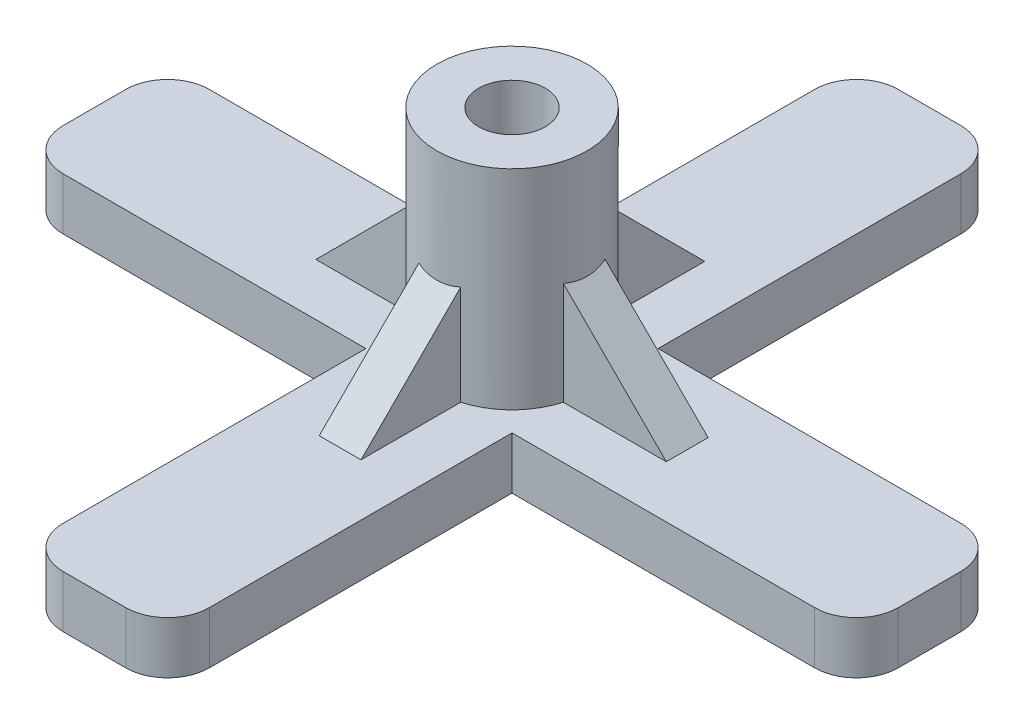
ISO-10303-21;
HEADER;
FILE_DESCRIPTION(('STEP AP214'),'2;1');
FILE_NAME('part.step','',(''),(''),'','','');
FILE_SCHEMA(('AUTOMOTIVE_DESIGN { 1 0 10303 214 1 1 1 1 }'));
ENDSEC;
DATA;
#1=APPLICATION_CONTEXT('core data for automotive mechanical design processes');
#2=APPLICATION_PROTOCOL_DEFINITION('international standard','automotive_design',2000,#1);
#3=PRODUCT_CONTEXT('',#1,'mechanical');
#4=PRODUCT('Part','Part','',(#3));
#5=PRODUCT_RELATED_PRODUCT_CATEGORY('part','',(#4));
#6=PRODUCT_DEFINITION_FORMATION('','',#4);
#7=PRODUCT_DEFINITION_CONTEXT('part definition',#1,'design');
#8=PRODUCT_DEFINITION('design','',#6,#7);
#9=PRODUCT_DEFINITION_SHAPE('','',#8);
#10=(LENGTH_UNIT() NAMED_UNIT(*) SI_UNIT(.MILLI.,.METRE.));
#11=(NAMED_UNIT(*) PLANE_ANGLE_UNIT() SI_UNIT($,.RADIAN.));
#12=(NAMED_UNIT(*) SI_UNIT($,.STERADIAN.) SOLID_ANGLE_UNIT());
#13=UNCERTAINTY_MEASURE_WITH_UNIT(LENGTH_MEASURE(1.E-05),#10,'distance_accuracy_value','');
#14=(GEOMETRIC_REPRESENTATION_CONTEXT(3) GLOBAL_UNCERTAINTY_ASSIGNED_CONTEXT((#13)) GLOBAL_UNIT_ASSIGNED_CONTEXT((#10,
#11,#12)) REPRESENTATION_CONTEXT('',''));
#15=CARTESIAN_POINT('',(0.,0.,0.));
#16=DIRECTION('',(0.,0.,1.));
#17=DIRECTION('',(1.,0.,0.));
#18=AXIS2_PLACEMENT_3D('',#15,#16,#17);
#19=CARTESIAN_POINT('',(1.90499999999999,3.175,-22.86));
#20=DIRECTION('',(0.,-1.,0.));
#21=DIRECTION('',(0.,0.,-1.));
#22=AXIS2_PLACEMENT_3D('',#19,#20,#21);
#23=PLANE('',#22);
#24=CARTESIAN_POINT('',(1.90499999999999,3.175,-22.86));
#25=DIRECTION('',(0.,1.,0.));
#26=DIRECTION('',(0.,0.,-1.));
#27=AXIS2_PLACEMENT_3D('',#24,#25,#26);
#28=CIRCLE('',#27,2.54);
#29=CARTESIAN_POINT('',(4.44499999999999,3.175,-22.8599999999999));
#30=VERTEX_POINT('',#29);
#31=CARTESIAN_POINT('',(1.90499999999998,3.175,-25.4));
#32=VERTEX_POINT('',#31);
#33=EDGE_CURVE('E312',#30,#32,#28,.T.);
#34=ORIENTED_EDGE('',*,*,#33,.T.);
#35=DIRECTION('',(-1.,0.,0.));
#36=VECTOR('',#35,1.);
#37=CARTESIAN_POINT('',(1.90499999999998,3.175,-25.4));
#38=LINE('',#37,#36);
#39=CARTESIAN_POINT('',(-1.90499999999999,3.175,-25.4));
#40=VERTEX_POINT('',#39);
#41=EDGE_CURVE('E315',#32,#40,#38,.T.);
#42=ORIENTED_EDGE('',*,*,#41,.T.);
#43=CARTESIAN_POINT('',(-1.90500000000001,3.175,-22.86));
#44=DIRECTION('',(0.,1.,0.));
#45=DIRECTION('',(0.,0.,1.));
#46=AXIS2_PLACEMENT_3D('',#43,#44,#45);
#47=CIRCLE('',#46,2.54);
#48=CARTESIAN_POINT('',(-4.44500000000001,3.175,-22.8599999999999));
#49=VERTEX_POINT('',#48);
#50=EDGE_CURVE('E318',#40,#49,#47,.T.);
#51=ORIENTED_EDGE('',*,*,#50,.T.);
#52=DIRECTION('',(0.,0.,1.));
#53=VECTOR('',#52,1.);
#54=CARTESIAN_POINT('',(-4.44500000000001,3.175,-22.8599999999999));
#55=LINE('',#54,#53);
#56=CARTESIAN_POINT('',(-4.445,3.175,-4.44499999999999));
#57=VERTEX_POINT('',#56);
#58=EDGE_CURVE('E320',#49,#57,#55,.T.);
#59=ORIENTED_EDGE('',*,*,#58,.T.);
#60=DIRECTION('',(-1.,0.,0.));
#61=VECTOR('',#60,1.);
#62=CARTESIAN_POINT('',(-22.86,3.175,-4.44499999999998));
#63=LINE('',#62,#61);
#64=CARTESIAN_POINT('',(-22.86,3.175,-4.44499999999998));
#65=VERTEX_POINT('',#64);
#66=EDGE_CURVE('E322',#57,#65,#63,.T.);
#67=ORIENTED_EDGE('',*,*,#66,.T.);
#68=CARTESIAN_POINT('',(-22.86,3.175,-1.90499999999998));
#69=DIRECTION('',(0.,1.,0.));
#70=DIRECTION('',(0.,0.,-1.));
#71=AXIS2_PLACEMENT_3D('',#68,#69,#70);
#72=CIRCLE('',#71,2.54);
#73=CARTESIAN_POINT('',(-25.4,3.175,-1.90499999999996));
#74=VERTEX_POINT('',#73);
#75=EDGE_CURVE('E324',#65,#74,#72,.T.);
#76=ORIENTED_EDGE('',*,*,#75,.T.);
#77=DIRECTION('',(0.,0.,1.));
#78=VECTOR('',#77,1.);
#79=CARTESIAN_POINT('',(-25.4,3.175,-1.90499999999996));
#80=LINE('',#79,#78);
#81=CARTESIAN_POINT('',(-25.4,3.175,1.905));
#82=VERTEX_POINT('',#81);
#83=EDGE_CURVE('E326',#74,#82,#80,.T.);
#84=ORIENTED_EDGE('',*,*,#83,.T.);
#85=CARTESIAN_POINT('',(-22.86,3.175,1.90500000000002));
#86=DIRECTION('',(0.,1.,0.));
#87=DIRECTION('',(0.,0.,1.));
#88=AXIS2_PLACEMENT_3D('',#85,#86,#87);
#89=CIRCLE('',#88,2.54);
#90=CARTESIAN_POINT('',(-22.86,3.175,4.44500000000002));
#91=VERTEX_POINT('',#90);
#92=EDGE_CURVE('E328',#82,#91,#89,.T.);
#93=ORIENTED_EDGE('',*,*,#92,.T.);
#94=DIRECTION('',(1.,0.,0.));
#95=VECTOR('',#94,1.);
#96=CARTESIAN_POINT('',(-22.86,3.175,4.44500000000002));
#97=LINE('',#96,#95);
#98=CARTESIAN_POINT('',(-4.445,3.175,4.445));
#99=VERTEX_POINT('',#98);
#100=EDGE_CURVE('E330',#91,#99,#97,.T.);
#101=ORIENTED_EDGE('',*,*,#100,.T.);
#102=DIRECTION('',(0.,0.,1.));
#103=VECTOR('',#102,1.);
#104=CARTESIAN_POINT('',(-4.445,3.175,22.86));
#105=LINE('',#104,#103);
#106=CARTESIAN_POINT('',(-4.445,3.175,22.86));
#107=VERTEX_POINT('',#106);
#108=EDGE_CURVE('E332',#99,#107,#105,.T.);
#109=ORIENTED_EDGE('',*,*,#108,.T.);
#110=CARTESIAN_POINT('',(-1.905,3.175,22.86));
#111=DIRECTION('',(0.,1.,0.));
#112=DIRECTION('',(0.,0.,-1.));
#113=AXIS2_PLACEMENT_3D('',#110,#111,#112);
#114=CIRCLE('',#113,2.54);
#115=CARTESIAN_POINT('',(-1.90499999999998,3.175,25.4));
#116=VERTEX_POINT('',#115);
#117=EDGE_CURVE('E334',#107,#116,#114,.T.);
#118=ORIENTED_EDGE('',*,*,#117,.T.);
#119=DIRECTION('',(1.,0.,0.));
#120=VECTOR('',#119,1.);
#121=CARTESIAN_POINT('',(-1.90499999999998,3.175,25.4));
#122=LINE('',#121,#120);
#123=CARTESIAN_POINT('',(1.90499999999999,3.175,25.4));
#124=VERTEX_POINT('',#123);
#125=EDGE_CURVE('E336',#116,#124,#122,.T.);
#126=ORIENTED_EDGE('',*,*,#125,.T.);
#127=CARTESIAN_POINT('',(1.905,3.175,22.86));
#128=DIRECTION('',(0.,1.,0.));
#129=DIRECTION('',(0.,0.,1.));
#130=AXIS2_PLACEMENT_3D('',#127,#128,#129);
#131=CIRCLE('',#130,2.54);
#132=CARTESIAN_POINT('',(4.445,3.175,22.86));
#133=VERTEX_POINT('',#132);
#134=EDGE_CURVE('E338',#124,#133,#131,.T.);
#135=ORIENTED_EDGE('',*,*,#134,.T.);
#136=DIRECTION('',(0.,0.,-1.));
#137=VECTOR('',#136,1.);
#138=CARTESIAN_POINT('',(4.445,3.175,22.86));
#139=LINE('',#138,#137);
#140=CARTESIAN_POINT('',(4.445,3.175,4.445));
#141=VERTEX_POINT('',#140);
#142=EDGE_CURVE('E340',#133,#141,#139,.T.);
#143=ORIENTED_EDGE('',*,*,#142,.T.);
#144=DIRECTION('',(1.,0.,0.));
#145=VECTOR('',#144,1.);
#146=CARTESIAN_POINT('',(22.86,3.175,4.44500000000001));
#147=LINE('',#146,#145);
#148=CARTESIAN_POINT('',(22.86,3.175,4.44500000000001));
#149=VERTEX_POINT('',#148);
#150=EDGE_CURVE('E342',#141,#149,#147,.T.);
#151=ORIENTED_EDGE('',*,*,#150,.T.);
#152=CARTESIAN_POINT('',(22.86,3.175,1.90500000000001));
#153=DIRECTION('',(0.,1.,0.));
#154=DIRECTION('',(0.,0.,-1.));
#155=AXIS2_PLACEMENT_3D('',#152,#153,#154);
#156=CIRCLE('',#155,2.54);
#157=CARTESIAN_POINT('',(25.4,3.175,1.90499999999999));
#158=VERTEX_POINT('',#157);
#159=EDGE_CURVE('E344',#149,#158,#156,.T.);
#160=ORIENTED_EDGE('',*,*,#159,.T.);
#161=DIRECTION('',(0.,0.,-1.));
#162=VECTOR('',#161,1.);
#163=CARTESIAN_POINT('',(25.4,3.175,1.90499999999999));
#164=LINE('',#163,#162);
#165=CARTESIAN_POINT('',(25.4,3.175,-1.90499999999997));
#166=VERTEX_POINT('',#165);
#167=EDGE_CURVE('E346',#158,#166,#164,.T.);
#168=ORIENTED_EDGE('',*,*,#167,.T.);
#169=CARTESIAN_POINT('',(22.86,3.175,-1.90499999999999));
#170=DIRECTION('',(0.,1.,0.));
#171=DIRECTION('',(0.,0.,1.));
#172=AXIS2_PLACEMENT_3D('',#169,#170,#171);
#173=CIRCLE('',#172,2.54);
#174=CARTESIAN_POINT('',(22.86,3.175,-4.44499999999999));
#175=VERTEX_POINT('',#174);
#176=EDGE_CURVE('E348',#166,#175,#173,.T.);
#177=ORIENTED_EDGE('',*,*,#176,.T.);
#178=DIRECTION('',(-1.,0.,0.));
#179=VECTOR('',#178,1.);
#180=CARTESIAN_POINT('',(22.86,3.175,-4.44499999999999));
#181=LINE('',#180,#179);
#182=CARTESIAN_POINT('',(4.445,3.175,-4.44499999999999));
#183=VERTEX_POINT('',#182);
#184=EDGE_CURVE('E350',#175,#183,#181,.T.);
#185=ORIENTED_EDGE('',*,*,#184,.T.);
#186=DIRECTION('',(0.,0.,-1.));
#187=VECTOR('',#186,1.);
#188=CARTESIAN_POINT('',(4.44499999999999,3.175,-22.8599999999999));
#189=LINE('',#188,#187);
#190=EDGE_CURVE('E352',#183,#30,#189,.T.);
#191=ORIENTED_EDGE('',*,*,#190,.T.);
#192=EDGE_LOOP('',(#34,#42,#51,#59,#67,#76,#84,#93,#101,#109,#118,#126,#135,#143,#151,#160,#168,
#177,#185,#191));
#193=FACE_BOUND('',#192,.T.);
#194=DIRECTION('',(-1.,0.,0.));
#195=VECTOR('',#194,1.);
#196=CARTESIAN_POINT('',(1.27,3.175,-10.456553941695));
#197=LINE('',#196,#195);
#198=CARTESIAN_POINT('',(1.27,3.175,-10.456553941695));
#199=VERTEX_POINT('',#198);
#200=CARTESIAN_POINT('',(-1.27,3.175,-10.456553941695));
#201=VERTEX_POINT('',#200);
#202=EDGE_CURVE('E48',#199,#201,#197,.T.);
#203=ORIENTED_EDGE('',*,*,#202,.F.);
#204=DIRECTION('',(0.,0.,-1.));
#205=VECTOR('',#204,1.);
#206=CARTESIAN_POINT('',(1.27,3.175,-10.456553941695));
#207=LINE('',#206,#205);
#208=CARTESIAN_POINT('',(1.27,3.175,-4.39207058231081));
#209=VERTEX_POINT('',#208);
#210=EDGE_CURVE('E255',#209,#199,#207,.T.);
#211=ORIENTED_EDGE('',*,*,#210,.F.);
#212=CARTESIAN_POINT('',(0.,3.175,0.));
#213=DIRECTION('',(0.,-1.,0.));
#214=DIRECTION('',(0.,0.,-1.));
#215=AXIS2_PLACEMENT_3D('',#212,#213,#214);
#216=CIRCLE('',#215,4.572);
#217=CARTESIAN_POINT('',(4.39207058231081,3.175,-1.27));
#218=VERTEX_POINT('',#217);
#219=EDGE_CURVE('E459',#218,#209,#216,.F.);
#220=ORIENTED_EDGE('',*,*,#219,.F.);
#221=DIRECTION('',(1.,0.,0.));
#222=VECTOR('',#221,1.);
#223=CARTESIAN_POINT('',(10.65929558815,3.175,-1.27));
#224=LINE('',#223,#222);
#225=CARTESIAN_POINT('',(10.65929558815,3.175,-1.27));
#226=VERTEX_POINT('',#225);
#227=EDGE_CURVE('E280',#218,#226,#224,.T.);
#228=ORIENTED_EDGE('',*,*,#227,.T.);
#229=DIRECTION('',(0.,0.,-1.));
#230=VECTOR('',#229,1.);
#231=CARTESIAN_POINT('',(10.65929558815,3.175,1.27));
#232=LINE('',#231,#230);
#233=CARTESIAN_POINT('',(10.65929558815,3.175,1.27));
#234=VERTEX_POINT('',#233);
#235=EDGE_CURVE('E282',#234,#226,#232,.T.);
#236=ORIENTED_EDGE('',*,*,#235,.F.);
#237=DIRECTION('',(1.,0.,0.));
#238=VECTOR('',#237,1.);
#239=CARTESIAN_POINT('',(10.65929558815,3.175,1.27));
#240=LINE('',#239,#238);
#241=CARTESIAN_POINT('',(4.39207058231081,3.175,1.27));
#242=VERTEX_POINT('',#241);
#243=EDGE_CURVE('E279',#242,#234,#240,.T.);
#244=ORIENTED_EDGE('',*,*,#243,.F.);
#245=CARTESIAN_POINT('',(1.27,3.175,4.39207058231081));
#246=VERTEX_POINT('',#245);
#247=EDGE_CURVE('E458',#246,#242,#216,.F.);
#248=ORIENTED_EDGE('',*,*,#247,.F.);
#249=DIRECTION('',(0.,0.,-1.));
#250=VECTOR('',#249,1.);
#251=CARTESIAN_POINT('',(1.27,3.175,10.456553941695));
#252=LINE('',#251,#250);
#253=CARTESIAN_POINT('',(1.27,3.175,10.456553941695));
#254=VERTEX_POINT('',#253);
#255=EDGE_CURVE('E266',#254,#246,#252,.T.);
#256=ORIENTED_EDGE('',*,*,#255,.F.);
#257=DIRECTION('',(-1.,0.,0.));
#258=VECTOR('',#257,1.);
#259=CARTESIAN_POINT('',(1.27,3.175,10.456553941695));
#260=LINE('',#259,#258);
#261=CARTESIAN_POINT('',(-1.27,3.175,10.456553941695));
#262=VERTEX_POINT('',#261);
#263=EDGE_CURVE('E269',#254,#262,#260,.T.);
#264=ORIENTED_EDGE('',*,*,#263,.T.);
#265=DIRECTION('',(0.,0.,-1.));
#266=VECTOR('',#265,1.);
#267=CARTESIAN_POINT('',(-1.27,3.175,10.456553941695));
#268=LINE('',#267,#266);
#269=CARTESIAN_POINT('',(-1.27,3.175,4.39207058231081));
#270=VERTEX_POINT('',#269);
#271=EDGE_CURVE('E267',#262,#270,#268,.T.);
#272=ORIENTED_EDGE('',*,*,#271,.T.);
#273=CARTESIAN_POINT('',(-4.39207058231081,3.175,1.27));
#274=VERTEX_POINT('',#273);
#275=EDGE_CURVE('E454',#274,#270,#216,.F.);
#276=ORIENTED_EDGE('',*,*,#275,.F.);
#277=DIRECTION('',(1.,0.,0.));
#278=VECTOR('',#277,1.);
#279=CARTESIAN_POINT('',(-10.65929558815,3.175,1.27));
#280=LINE('',#279,#278);
#281=CARTESIAN_POINT('',(-10.65929558815,3.175,1.27));
#282=VERTEX_POINT('',#281);
#283=EDGE_CURVE('E292',#282,#274,#280,.T.);
#284=ORIENTED_EDGE('',*,*,#283,.F.);
#285=DIRECTION('',(0.,0.,-1.));
#286=VECTOR('',#285,1.);
#287=CARTESIAN_POINT('',(-10.65929558815,3.175,1.27));
#288=LINE('',#287,#286);
#289=CARTESIAN_POINT('',(-10.65929558815,3.175,-1.27));
#290=VERTEX_POINT('',#289);
#291=EDGE_CURVE('E296',#282,#290,#288,.T.);
#292=ORIENTED_EDGE('',*,*,#291,.T.);
#293=DIRECTION('',(1.,0.,0.));
#294=VECTOR('',#293,1.);
#295=CARTESIAN_POINT('',(-10.65929558815,3.175,-1.27));
#296=LINE('',#295,#294);
#297=CARTESIAN_POINT('',(-4.39207058231081,3.175,-1.27));
#298=VERTEX_POINT('',#297);
#299=EDGE_CURVE('E293',#290,#298,#296,.T.);
#300=ORIENTED_EDGE('',*,*,#299,.T.);
#301=CARTESIAN_POINT('',(-1.27,3.175,-4.39207058231081));
#302=VERTEX_POINT('',#301);
#303=EDGE_CURVE('E453',#302,#298,#216,.F.);
#304=ORIENTED_EDGE('',*,*,#303,.F.);
#305=DIRECTION('',(0.,0.,-1.));
#306=VECTOR('',#305,1.);
#307=CARTESIAN_POINT('',(-1.27,3.175,-10.456553941695));
#308=LINE('',#307,#306);
#309=EDGE_CURVE('E53',#302,#201,#308,.T.);
#310=ORIENTED_EDGE('',*,*,#309,.T.);
#311=EDGE_LOOP('',(#203,#211,#220,#228,#236,#244,#248,#256,#264,#272,#276,#284,#292,#300,#304,#310));
#312=FACE_BOUND('',#311,.T.);
#313=ADVANCED_FACE('F33',(#193,#312),#23,.F.);
#314=CARTESIAN_POINT('',(0.,15.875,0.));
#315=DIRECTION('',(0.,-1.,0.));
#316=DIRECTION('',(0.,0.,-1.));
#317=AXIS2_PLACEMENT_3D('',#314,#315,#316);
#318=CYLINDRICAL_SURFACE('',#317,4.572);
#319=CARTESIAN_POINT('',(0.,15.875,0.));
#320=DIRECTION('',(0.,1.,0.));
#321=DIRECTION('',(0.,0.,1.));
#322=AXIS2_PLACEMENT_3D('',#319,#320,#321);
#323=CIRCLE('',#322,4.572);
#324=CARTESIAN_POINT('',(0.,15.875,4.572));
#325=VERTEX_POINT('',#324);
#326=EDGE_CURVE('E306',#325,#325,#323,.T.);
#327=ORIENTED_EDGE('',*,*,#326,.F.);
#328=EDGE_LOOP('',(#327));
#329=FACE_BOUND('',#328,.T.);
#330=ORIENTED_EDGE('',*,*,#219,.T.);
#331=DIRECTION('',(0.,-1.,0.));
#332=VECTOR('',#331,1.);
#333=CARTESIAN_POINT('',(1.27,15.875,-4.39207058231081));
#334=LINE('',#333,#332);
#335=CARTESIAN_POINT('',(1.27,9.23948335938423,-4.39207058231081));
#336=VERTEX_POINT('',#335);
#337=EDGE_CURVE('E11',#209,#336,#334,.F.);
#338=ORIENTED_EDGE('',*,*,#337,.T.);
#339=CARTESIAN_POINT('',(0.,13.631553941695,0.));
#340=DIRECTION('',(0.,-0.707106781186548,0.707106781186547));
#341=DIRECTION('',(0.,-0.707106781186547,-0.707106781186548));
#342=AXIS2_PLACEMENT_3D('',#339,#340,#341);
#343=ELLIPSE('',#342,6.46578440716979,4.572);
#344=CARTESIAN_POINT('',(-1.27,9.23948335938423,-4.39207058231081));
#345=VERTEX_POINT('',#344);
#346=EDGE_CURVE('E41',#345,#336,#343,.T.);
#347=ORIENTED_EDGE('',*,*,#346,.F.);
#348=DIRECTION('',(0.,-1.,0.));
#349=VECTOR('',#348,1.);
#350=CARTESIAN_POINT('',(-1.27,15.875,-4.39207058231081));
#351=LINE('',#350,#349);
#352=EDGE_CURVE('E242',#302,#345,#351,.F.);
#353=ORIENTED_EDGE('',*,*,#352,.F.);
#354=ORIENTED_EDGE('',*,*,#303,.T.);
#355=DIRECTION('',(0.,-1.,0.));
#356=VECTOR('',#355,1.);
#357=CARTESIAN_POINT('',(-4.39207058231081,15.875,-1.27));
#358=LINE('',#357,#356);
#359=CARTESIAN_POINT('',(-4.39207058231081,9.44222500583922,-1.27));
#360=VERTEX_POINT('',#359);
#361=EDGE_CURVE('E457',#360,#298,#358,.T.);
#362=ORIENTED_EDGE('',*,*,#361,.F.);
#363=CARTESIAN_POINT('',(0.,13.83429558815,0.));
#364=DIRECTION('',(0.707106781186547,-0.707106781186548,0.));
#365=DIRECTION('',(-0.707106781186548,-0.707106781186547,0.));
#366=AXIS2_PLACEMENT_3D('',#363,#364,#365);
#367=ELLIPSE('',#366,6.46578440716979,4.572);
#368=CARTESIAN_POINT('',(-4.39207058231081,9.44222500583922,1.27));
#369=VERTEX_POINT('',#368);
#370=EDGE_CURVE('E462',#369,#360,#367,.T.);
#371=ORIENTED_EDGE('',*,*,#370,.F.);
#372=DIRECTION('',(0.,-1.,0.));
#373=VECTOR('',#372,1.);
#374=CARTESIAN_POINT('',(-4.39207058231081,15.875,1.27));
#375=LINE('',#374,#373);
#376=EDGE_CURVE('E465',#369,#274,#375,.T.);
#377=ORIENTED_EDGE('',*,*,#376,.T.);
#378=ORIENTED_EDGE('',*,*,#275,.T.);
#379=DIRECTION('',(0.,-1.,0.));
#380=VECTOR('',#379,1.);
#381=CARTESIAN_POINT('',(-1.27,15.875,4.39207058231081));
#382=LINE('',#381,#380);
#383=CARTESIAN_POINT('',(-1.27,9.23948335938423,4.39207058231081));
#384=VERTEX_POINT('',#383);
#385=EDGE_CURVE('E475',#270,#384,#382,.F.);
#386=ORIENTED_EDGE('',*,*,#385,.T.);
#387=CARTESIAN_POINT('',(0.,13.631553941695,0.));
#388=DIRECTION('',(0.,-0.707106781186548,-0.707106781186547));
#389=DIRECTION('',(0.,-0.707106781186547,0.707106781186548));
#390=AXIS2_PLACEMENT_3D('',#387,#388,#389);
#391=ELLIPSE('',#390,6.46578440716979,4.572);
#392=CARTESIAN_POINT('',(1.27,9.23948335938423,4.39207058231081));
#393=VERTEX_POINT('',#392);
#394=EDGE_CURVE('E478',#393,#384,#391,.T.);
#395=ORIENTED_EDGE('',*,*,#394,.F.);
#396=DIRECTION('',(0.,-1.,0.));
#397=VECTOR('',#396,1.);
#398=CARTESIAN_POINT('',(1.27,15.875,4.39207058231081));
#399=LINE('',#398,#397);
#400=EDGE_CURVE('E252',#246,#393,#399,.F.);
#401=ORIENTED_EDGE('',*,*,#400,.F.);
#402=ORIENTED_EDGE('',*,*,#247,.T.);
#403=DIRECTION('',(0.,-1.,0.));
#404=VECTOR('',#403,1.);
#405=CARTESIAN_POINT('',(4.39207058231081,15.875,1.27));
#406=LINE('',#405,#404);
#407=CARTESIAN_POINT('',(4.39207058231081,9.44222500583922,1.27));
#408=VERTEX_POINT('',#407);
#409=EDGE_CURVE('E472',#408,#242,#406,.T.);
#410=ORIENTED_EDGE('',*,*,#409,.F.);
#411=CARTESIAN_POINT('',(0.,13.83429558815,0.));
#412=DIRECTION('',(-0.707106781186547,-0.707106781186548,0.));
#413=DIRECTION('',(0.707106781186548,-0.707106781186547,0.));
#414=AXIS2_PLACEMENT_3D('',#411,#412,#413);
#415=ELLIPSE('',#414,6.46578440716979,4.572);
#416=CARTESIAN_POINT('',(4.39207058231081,9.44222500583922,-1.27));
#417=VERTEX_POINT('',#416);
#418=EDGE_CURVE('E470',#417,#408,#415,.T.);
#419=ORIENTED_EDGE('',*,*,#418,.F.);
#420=DIRECTION('',(0.,-1.,0.));
#421=VECTOR('',#420,1.);
#422=CARTESIAN_POINT('',(4.39207058231081,15.875,-1.27));
#423=LINE('',#422,#421);
#424=EDGE_CURVE('E467',#417,#218,#423,.T.);
#425=ORIENTED_EDGE('',*,*,#424,.T.);
#426=EDGE_LOOP('',(#330,#338,#347,#353,#354,#362,#371,#377,#378,#386,#395,#401,#402,#410,#419,#425));
#427=FACE_BOUND('',#426,.T.);
#428=ADVANCED_FACE('F241',(#329,#427),#318,.T.);
#429=CARTESIAN_POINT('',(1.90499999999999,3.175,-22.86));
#430=DIRECTION('',(0.,-1.,0.));
#431=DIRECTION('',(0.,0.,-1.));
#432=AXIS2_PLACEMENT_3D('',#429,#430,#431);
#433=CYLINDRICAL_SURFACE('',#432,2.54);
#434=CARTESIAN_POINT('',(1.90499999999999,0.,-22.86));
#435=DIRECTION('',(0.,1.,0.));
#436=DIRECTION('',(0.,0.,-1.));
#437=AXIS2_PLACEMENT_3D('',#434,#435,#436);
#438=CIRCLE('',#437,2.54);
#439=CARTESIAN_POINT('',(4.44499999999999,0.,-22.8599999999999));
#440=VERTEX_POINT('',#439);
#441=CARTESIAN_POINT('',(1.90499999999998,0.,-25.4));
#442=VERTEX_POINT('',#441);
#443=EDGE_CURVE('E311',#440,#442,#438,.T.);
#444=ORIENTED_EDGE('',*,*,#443,.T.);
#445=DIRECTION('',(0.,-1.,0.));
#446=VECTOR('',#445,1.);
#447=CARTESIAN_POINT('',(1.90499999999998,3.175,-25.4));
#448=LINE('',#447,#446);
#449=EDGE_CURVE('E450',#32,#442,#448,.T.);
#450=ORIENTED_EDGE('',*,*,#449,.F.);
#451=ORIENTED_EDGE('',*,*,#33,.F.);
#452=DIRECTION('',(0.,-1.,0.));
#453=VECTOR('',#452,1.);
#454=CARTESIAN_POINT('',(4.44499999999999,3.175,-22.8599999999999));
#455=LINE('',#454,#453);
#456=EDGE_CURVE('E354',#30,#440,#455,.T.);
#457=ORIENTED_EDGE('',*,*,#456,.T.);
#458=EDGE_LOOP('',(#444,#450,#451,#457));
#459=FACE_BOUND('',#458,.T.);
#460=ADVANCED_FACE('F35',(#459),#433,.T.);
#461=CARTESIAN_POINT('',(1.90499999999998,3.175,-25.4));
#462=DIRECTION('',(0.,0.,1.));
#463=DIRECTION('',(1.,0.,0.));
#464=AXIS2_PLACEMENT_3D('',#461,#462,#463);
#465=PLANE('',#464);
#466=DIRECTION('',(-1.,0.,0.));
#467=VECTOR('',#466,1.);
#468=CARTESIAN_POINT('',(1.90499999999998,0.,-25.4));
#469=LINE('',#468,#467);
#470=CARTESIAN_POINT('',(-1.90499999999999,0.,-25.4));
#471=VERTEX_POINT('',#470);
#472=EDGE_CURVE('E357',#442,#471,#469,.T.);
#473=ORIENTED_EDGE('',*,*,#472,.T.);
#474=DIRECTION('',(0.,-1.,0.));
#475=VECTOR('',#474,1.);
#476=CARTESIAN_POINT('',(-1.90499999999999,3.175,-25.4));
#477=LINE('',#476,#475);
#478=EDGE_CURVE('E447',#40,#471,#477,.T.);
#479=ORIENTED_EDGE('',*,*,#478,.F.);
#480=ORIENTED_EDGE('',*,*,#41,.F.);
#481=ORIENTED_EDGE('',*,*,#449,.T.);
#482=EDGE_LOOP('',(#473,#479,#480,#481));
#483=FACE_BOUND('',#482,.T.);
#484=ADVANCED_FACE('F605',(#483),#465,.F.);
#485=CARTESIAN_POINT('',(-1.90500000000001,3.175,-22.86));
#486=DIRECTION('',(0.,-1.,0.));
#487=DIRECTION('',(0.,0.,-1.));
#488=AXIS2_PLACEMENT_3D('',#485,#486,#487);
#489=CYLINDRICAL_SURFACE('',#488,2.54);
#490=CARTESIAN_POINT('',(-1.90500000000001,0.,-22.86));
#491=DIRECTION('',(0.,1.,0.));
#492=DIRECTION('',(0.,0.,1.));
#493=AXIS2_PLACEMENT_3D('',#490,#491,#492);
#494=CIRCLE('',#493,2.54);
#495=CARTESIAN_POINT('',(-4.44500000000001,0.,-22.8599999999999));
#496=VERTEX_POINT('',#495);
#497=EDGE_CURVE('E359',#471,#496,#494,.T.);
#498=ORIENTED_EDGE('',*,*,#497,.T.);
#499=DIRECTION('',(0.,-1.,0.));
#500=VECTOR('',#499,1.);
#501=CARTESIAN_POINT('',(-4.44500000000001,3.175,-22.8599999999999));
#502=LINE('',#501,#500);
#503=EDGE_CURVE('E444',#49,#496,#502,.T.);
#504=ORIENTED_EDGE('',*,*,#503,.F.);
#505=ORIENTED_EDGE('',*,*,#50,.F.);
#506=ORIENTED_EDGE('',*,*,#478,.T.);
#507=EDGE_LOOP('',(#498,#504,#505,#506));
#508=FACE_BOUND('',#507,.T.);
#509=ADVANCED_FACE('F602',(#508),#489,.T.);
#510=CARTESIAN_POINT('',(-4.44500000000001,3.175,-22.8599999999999));
#511=DIRECTION('',(1.,0.,0.));
#512=DIRECTION('',(0.,0.,-1.));
#513=AXIS2_PLACEMENT_3D('',#510,#511,#512);
#514=PLANE('',#513);
#515=DIRECTION('',(0.,0.,1.));
#516=VECTOR('',#515,1.);
#517=CARTESIAN_POINT('',(-4.44500000000001,0.,-22.8599999999999));
#518=LINE('',#517,#516);
#519=CARTESIAN_POINT('',(-4.445,0.,-4.44499999999999));
#520=VERTEX_POINT('',#519);
#521=EDGE_CURVE('E361',#496,#520,#518,.T.);
#522=ORIENTED_EDGE('',*,*,#521,.T.);
#523=DIRECTION('',(0.,-1.,0.));
#524=VECTOR('',#523,1.);
#525=CARTESIAN_POINT('',(-4.445,3.175,-4.44499999999999));
#526=LINE('',#525,#524);
#527=EDGE_CURVE('E441',#57,#520,#526,.T.);
#528=ORIENTED_EDGE('',*,*,#527,.F.);
#529=ORIENTED_EDGE('',*,*,#58,.F.);
#530=ORIENTED_EDGE('',*,*,#503,.T.);
#531=EDGE_LOOP('',(#522,#528,#529,#530));
#532=FACE_BOUND('',#531,.T.);
#533=ADVANCED_FACE('F598',(#532),#514,.F.);
#534=CARTESIAN_POINT('',(-22.86,3.175,-4.44499999999998));
#535=DIRECTION('',(0.,0.,1.));
#536=DIRECTION('',(1.,0.,0.));
#537=AXIS2_PLACEMENT_3D('',#534,#535,#536);
#538=PLANE('',#537);
#539=DIRECTION('',(-1.,0.,0.));
#540=VECTOR('',#539,1.);
#541=CARTESIAN_POINT('',(-22.86,0.,-4.44499999999998));
#542=LINE('',#541,#540);
#543=CARTESIAN_POINT('',(-22.86,0.,-4.44499999999998));
#544=VERTEX_POINT('',#543);
#545=EDGE_CURVE('E363',#520,#544,#542,.T.);
#546=ORIENTED_EDGE('',*,*,#545,.T.);
#547=DIRECTION('',(0.,-1.,0.));
#548=VECTOR('',#547,1.);
#549=CARTESIAN_POINT('',(-22.86,3.175,-4.44499999999998));
#550=LINE('',#549,#548);
#551=EDGE_CURVE('E438',#65,#544,#550,.T.);
#552=ORIENTED_EDGE('',*,*,#551,.F.);
#553=ORIENTED_EDGE('',*,*,#66,.F.);
#554=ORIENTED_EDGE('',*,*,#527,.T.);
#555=EDGE_LOOP('',(#546,#552,#553,#554));
#556=FACE_BOUND('',#555,.T.);
#557=ADVANCED_FACE('F594',(#556),#538,.F.);
#558=CARTESIAN_POINT('',(-22.86,3.175,-1.90499999999998));
#559=DIRECTION('',(0.,-1.,0.));
#560=DIRECTION('',(0.,0.,-1.));
#561=AXIS2_PLACEMENT_3D('',#558,#559,#560);
#562=CYLINDRICAL_SURFACE('',#561,2.54);
#563=CARTESIAN_POINT('',(-22.86,0.,-1.90499999999998));
#564=DIRECTION('',(0.,1.,0.));
#565=DIRECTION('',(0.,0.,-1.));
#566=AXIS2_PLACEMENT_3D('',#563,#564,#565);
#567=CIRCLE('',#566,2.54);
#568=CARTESIAN_POINT('',(-25.4,0.,-1.90499999999996));
#569=VERTEX_POINT('',#568);
#570=EDGE_CURVE('E365',#544,#569,#567,.T.);
#571=ORIENTED_EDGE('',*,*,#570,.T.);
#572=DIRECTION('',(0.,-1.,0.));
#573=VECTOR('',#572,1.);
#574=CARTESIAN_POINT('',(-25.4,3.175,-1.90499999999996));
#575=LINE('',#574,#573);
#576=EDGE_CURVE('E435',#74,#569,#575,.T.);
#577=ORIENTED_EDGE('',*,*,#576,.F.);
#578=ORIENTED_EDGE('',*,*,#75,.F.);
#579=ORIENTED_EDGE('',*,*,#551,.T.);
#580=EDGE_LOOP('',(#571,#577,#578,#579));
#581=FACE_BOUND('',#580,.T.);
#582=ADVANCED_FACE('F590',(#581),#562,.T.);
#583=CARTESIAN_POINT('',(-25.4,3.175,-1.90499999999996));
#584=DIRECTION('',(1.,0.,0.));
#585=DIRECTION('',(0.,0.,-1.));
#586=AXIS2_PLACEMENT_3D('',#583,#584,#585);
#587=PLANE('',#586);
#588=DIRECTION('',(0.,0.,1.));
#589=VECTOR('',#588,1.);
#590=CARTESIAN_POINT('',(-25.4,0.,-1.90499999999996));
#591=LINE('',#590,#589);
#592=CARTESIAN_POINT('',(-25.4,0.,1.905));
#593=VERTEX_POINT('',#592);
#594=EDGE_CURVE('E367',#569,#593,#591,.T.);
#595=ORIENTED_EDGE('',*,*,#594,.T.);
#596=DIRECTION('',(0.,-1.,0.));
#597=VECTOR('',#596,1.);
#598=CARTESIAN_POINT('',(-25.4,3.175,1.905));
#599=LINE('',#598,#597);
#600=EDGE_CURVE('E432',#82,#593,#599,.T.);
#601=ORIENTED_EDGE('',*,*,#600,.F.);
#602=ORIENTED_EDGE('',*,*,#83,.F.);
#603=ORIENTED_EDGE('',*,*,#576,.T.);
#604=EDGE_LOOP('',(#595,#601,#602,#603));
#605=FACE_BOUND('',#604,.T.);
#606=ADVANCED_FACE('F586',(#605),#587,.F.);
#607=CARTESIAN_POINT('',(-22.86,3.175,1.90500000000002));
#608=DIRECTION('',(0.,-1.,0.));
#609=DIRECTION('',(0.,0.,-1.));
#610=AXIS2_PLACEMENT_3D('',#607,#608,#609);
#611=CYLINDRICAL_SURFACE('',#610,2.54);
#612=CARTESIAN_POINT('',(-22.86,0.,1.90500000000002));
#613=DIRECTION('',(0.,1.,0.));
#614=DIRECTION('',(0.,0.,1.));
#615=AXIS2_PLACEMENT_3D('',#612,#613,#614);
#616=CIRCLE('',#615,2.54);
#617=CARTESIAN_POINT('',(-22.86,0.,4.44500000000002));
#618=VERTEX_POINT('',#617);
#619=EDGE_CURVE('E369',#593,#618,#616,.T.);
#620=ORIENTED_EDGE('',*,*,#619,.T.);
#621=DIRECTION('',(0.,-1.,0.));
#622=VECTOR('',#621,1.);
#623=CARTESIAN_POINT('',(-22.86,3.175,4.44500000000002));
#624=LINE('',#623,#622);
#625=EDGE_CURVE('E429',#91,#618,#624,.T.);
#626=ORIENTED_EDGE('',*,*,#625,.F.);
#627=ORIENTED_EDGE('',*,*,#92,.F.);
#628=ORIENTED_EDGE('',*,*,#600,.T.);
#629=EDGE_LOOP('',(#620,#626,#627,#628));
#630=FACE_BOUND('',#629,.T.);
#631=ADVANCED_FACE('F582',(#630),#611,.T.);
#632=CARTESIAN_POINT('',(-22.86,3.175,4.44500000000002));
#633=DIRECTION('',(0.,0.,-1.));
#634=DIRECTION('',(-1.,0.,0.));
#635=AXIS2_PLACEMENT_3D('',#632,#633,#634);
#636=PLANE('',#635);
#637=DIRECTION('',(1.,0.,0.));
#638=VECTOR('',#637,1.);
#639=CARTESIAN_POINT('',(-22.86,0.,4.44500000000002));
#640=LINE('',#639,#638);
#641=CARTESIAN_POINT('',(-4.445,0.,4.445));
#642=VERTEX_POINT('',#641);
#643=EDGE_CURVE('E371',#618,#642,#640,.T.);
#644=ORIENTED_EDGE('',*,*,#643,.T.);
#645=DIRECTION('',(0.,-1.,0.));
#646=VECTOR('',#645,1.);
#647=CARTESIAN_POINT('',(-4.445,3.175,4.445));
#648=LINE('',#647,#646);
#649=EDGE_CURVE('E426',#99,#642,#648,.T.);
#650=ORIENTED_EDGE('',*,*,#649,.F.);
#651=ORIENTED_EDGE('',*,*,#100,.F.);
#652=ORIENTED_EDGE('',*,*,#625,.T.);
#653=EDGE_LOOP('',(#644,#650,#651,#652));
#654=FACE_BOUND('',#653,.T.);
#655=ADVANCED_FACE('F578',(#654),#636,.F.);
#656=CARTESIAN_POINT('',(-4.445,3.175,22.86));
#657=DIRECTION('',(1.,0.,0.));
#658=DIRECTION('',(0.,0.,-1.));
#659=AXIS2_PLACEMENT_3D('',#656,#657,#658);
#660=PLANE('',#659);
#661=DIRECTION('',(0.,0.,1.));
#662=VECTOR('',#661,1.);
#663=CARTESIAN_POINT('',(-4.445,0.,22.86));
#664=LINE('',#663,#662);
#665=CARTESIAN_POINT('',(-4.445,0.,22.86));
#666=VERTEX_POINT('',#665);
#667=EDGE_CURVE('E373',#642,#666,#664,.T.);
#668=ORIENTED_EDGE('',*,*,#667,.T.);
#669=DIRECTION('',(0.,-1.,0.));
#670=VECTOR('',#669,1.);
#671=CARTESIAN_POINT('',(-4.445,3.175,22.86));
#672=LINE('',#671,#670);
#673=EDGE_CURVE('E423',#107,#666,#672,.T.);
#674=ORIENTED_EDGE('',*,*,#673,.F.);
#675=ORIENTED_EDGE('',*,*,#108,.F.);
#676=ORIENTED_EDGE('',*,*,#649,.T.);
#677=EDGE_LOOP('',(#668,#674,#675,#676));
#678=FACE_BOUND('',#677,.T.);
#679=ADVANCED_FACE('F574',(#678),#660,.F.);
#680=CARTESIAN_POINT('',(-1.905,3.175,22.86));
#681=DIRECTION('',(0.,-1.,0.));
#682=DIRECTION('',(0.,0.,-1.));
#683=AXIS2_PLACEMENT_3D('',#680,#681,#682);
#684=CYLINDRICAL_SURFACE('',#683,2.54);
#685=CARTESIAN_POINT('',(-1.905,0.,22.86));
#686=DIRECTION('',(0.,1.,0.));
#687=DIRECTION('',(0.,0.,-1.));
#688=AXIS2_PLACEMENT_3D('',#685,#686,#687);
#689=CIRCLE('',#688,2.54);
#690=CARTESIAN_POINT('',(-1.90499999999998,0.,25.4));
#691=VERTEX_POINT('',#690);
#692=EDGE_CURVE('E375',#666,#691,#689,.T.);
#693=ORIENTED_EDGE('',*,*,#692,.T.);
#694=DIRECTION('',(0.,-1.,0.));
#695=VECTOR('',#694,1.);
#696=CARTESIAN_POINT('',(-1.90499999999998,3.175,25.4));
#697=LINE('',#696,#695);
#698=EDGE_CURVE('E420',#116,#691,#697,.T.);
#699=ORIENTED_EDGE('',*,*,#698,.F.);
#700=ORIENTED_EDGE('',*,*,#117,.F.);
#701=ORIENTED_EDGE('',*,*,#673,.T.);
#702=EDGE_LOOP('',(#693,#699,#700,#701));
#703=FACE_BOUND('',#702,.T.);
#704=ADVANCED_FACE('F570',(#703),#684,.T.);
#705=CARTESIAN_POINT('',(-1.90499999999998,3.175,25.4));
#706=DIRECTION('',(0.,0.,-1.));
#707=DIRECTION('',(-1.,0.,0.));
#708=AXIS2_PLACEMENT_3D('',#705,#706,#707);
#709=PLANE('',#708);
#710=DIRECTION('',(1.,0.,0.));
#711=VECTOR('',#710,1.);
#712=CARTESIAN_POINT('',(-1.90499999999998,0.,25.4));
#713=LINE('',#712,#711);
#714=CARTESIAN_POINT('',(1.90499999999999,0.,25.4));
#715=VERTEX_POINT('',#714);
#716=EDGE_CURVE('E377',#691,#715,#713,.T.);
#717=ORIENTED_EDGE('',*,*,#716,.T.);
#718=DIRECTION('',(0.,-1.,0.));
#719=VECTOR('',#718,1.);
#720=CARTESIAN_POINT('',(1.90499999999999,3.175,25.4));
#721=LINE('',#720,#719);
#722=EDGE_CURVE('E417',#124,#715,#721,.T.);
#723=ORIENTED_EDGE('',*,*,#722,.F.);
#724=ORIENTED_EDGE('',*,*,#125,.F.);
#725=ORIENTED_EDGE('',*,*,#698,.T.);
#726=EDGE_LOOP('',(#717,#723,#724,#725));
#727=FACE_BOUND('',#726,.T.);
#728=ADVANCED_FACE('F566',(#727),#709,.F.);
#729=CARTESIAN_POINT('',(1.905,3.175,22.86));
#730=DIRECTION('',(0.,-1.,0.));
#731=DIRECTION('',(0.,0.,-1.));
#732=AXIS2_PLACEMENT_3D('',#729,#730,#731);
#733=CYLINDRICAL_SURFACE('',#732,2.54);
#734=CARTESIAN_POINT('',(1.905,0.,22.86));
#735=DIRECTION('',(0.,1.,0.));
#736=DIRECTION('',(0.,0.,1.));
#737=AXIS2_PLACEMENT_3D('',#734,#735,#736);
#738=CIRCLE('',#737,2.54);
#739=CARTESIAN_POINT('',(4.445,0.,22.86));
#740=VERTEX_POINT('',#739);
#741=EDGE_CURVE('E379',#715,#740,#738,.T.);
#742=ORIENTED_EDGE('',*,*,#741,.T.);
#743=DIRECTION('',(0.,-1.,0.));
#744=VECTOR('',#743,1.);
#745=CARTESIAN_POINT('',(4.445,3.175,22.86));
#746=LINE('',#745,#744);
#747=EDGE_CURVE('E414',#133,#740,#746,.T.);
#748=ORIENTED_EDGE('',*,*,#747,.F.);
#749=ORIENTED_EDGE('',*,*,#134,.F.);
#750=ORIENTED_EDGE('',*,*,#722,.T.);
#751=EDGE_LOOP('',(#742,#748,#749,#750));
#752=FACE_BOUND('',#751,.T.);
#753=ADVANCED_FACE('F562',(#752),#733,.T.);
#754=CARTESIAN_POINT('',(4.445,3.175,22.86));
#755=DIRECTION('',(-1.,0.,0.));
#756=DIRECTION('',(0.,0.,1.));
#757=AXIS2_PLACEMENT_3D('',#754,#755,#756);
#758=PLANE('',#757);
#759=DIRECTION('',(0.,0.,-1.));
#760=VECTOR('',#759,1.);
#761=CARTESIAN_POINT('',(4.445,0.,22.86));
#762=LINE('',#761,#760);
#763=CARTESIAN_POINT('',(4.445,0.,4.445));
#764=VERTEX_POINT('',#763);
#765=EDGE_CURVE('E381',#740,#764,#762,.T.);
#766=ORIENTED_EDGE('',*,*,#765,.T.);
#767=DIRECTION('',(0.,-1.,0.));
#768=VECTOR('',#767,1.);
#769=CARTESIAN_POINT('',(4.445,3.175,4.445));
#770=LINE('',#769,#768);
#771=EDGE_CURVE('E411',#141,#764,#770,.T.);
#772=ORIENTED_EDGE('',*,*,#771,.F.);
#773=ORIENTED_EDGE('',*,*,#142,.F.);
#774=ORIENTED_EDGE('',*,*,#747,.T.);
#775=EDGE_LOOP('',(#766,#772,#773,#774));
#776=FACE_BOUND('',#775,.T.);
#777=ADVANCED_FACE('F558',(#776),#758,.F.);
#778=CARTESIAN_POINT('',(22.86,3.175,4.44500000000001));
#779=DIRECTION('',(0.,0.,-1.));
#780=DIRECTION('',(-1.,0.,0.));
#781=AXIS2_PLACEMENT_3D('',#778,#779,#780);
#782=PLANE('',#781);
#783=DIRECTION('',(1.,0.,0.));
#784=VECTOR('',#783,1.);
#785=CARTESIAN_POINT('',(22.86,0.,4.44500000000001));
#786=LINE('',#785,#784);
#787=CARTESIAN_POINT('',(22.86,0.,4.44500000000001));
#788=VERTEX_POINT('',#787);
#789=EDGE_CURVE('E383',#764,#788,#786,.T.);
#790=ORIENTED_EDGE('',*,*,#789,.T.);
#791=DIRECTION('',(0.,-1.,0.));
#792=VECTOR('',#791,1.);
#793=CARTESIAN_POINT('',(22.86,3.175,4.44500000000001));
#794=LINE('',#793,#792);
#795=EDGE_CURVE('E408',#149,#788,#794,.T.);
#796=ORIENTED_EDGE('',*,*,#795,.F.);
#797=ORIENTED_EDGE('',*,*,#150,.F.);
#798=ORIENTED_EDGE('',*,*,#771,.T.);
#799=EDGE_LOOP('',(#790,#796,#797,#798));
#800=FACE_BOUND('',#799,.T.);
#801=ADVANCED_FACE('F554',(#800),#782,.F.);
#802=CARTESIAN_POINT('',(22.86,3.175,1.90500000000001));
#803=DIRECTION('',(0.,-1.,0.));
#804=DIRECTION('',(0.,0.,-1.));
#805=AXIS2_PLACEMENT_3D('',#802,#803,#804);
#806=CYLINDRICAL_SURFACE('',#805,2.54);
#807=CARTESIAN_POINT('',(22.86,0.,1.90500000000001));
#808=DIRECTION('',(0.,1.,0.));
#809=DIRECTION('',(0.,0.,-1.));
#810=AXIS2_PLACEMENT_3D('',#807,#808,#809);
#811=CIRCLE('',#810,2.54);
#812=CARTESIAN_POINT('',(25.4,0.,1.90499999999999));
#813=VERTEX_POINT('',#812);
#814=EDGE_CURVE('E385',#788,#813,#811,.T.);
#815=ORIENTED_EDGE('',*,*,#814,.T.);
#816=DIRECTION('',(0.,-1.,0.));
#817=VECTOR('',#816,1.);
#818=CARTESIAN_POINT('',(25.4,3.175,1.90499999999999));
#819=LINE('',#818,#817);
#820=EDGE_CURVE('E405',#158,#813,#819,.T.);
#821=ORIENTED_EDGE('',*,*,#820,.F.);
#822=ORIENTED_EDGE('',*,*,#159,.F.);
#823=ORIENTED_EDGE('',*,*,#795,.T.);
#824=EDGE_LOOP('',(#815,#821,#822,#823));
#825=FACE_BOUND('',#824,.T.);
#826=ADVANCED_FACE('F550',(#825),#806,.T.);
#827=CARTESIAN_POINT('',(25.4,3.175,1.90499999999999));
#828=DIRECTION('',(-1.,0.,0.));
#829=DIRECTION('',(0.,0.,1.));
#830=AXIS2_PLACEMENT_3D('',#827,#828,#829);
#831=PLANE('',#830);
#832=DIRECTION('',(0.,0.,-1.));
#833=VECTOR('',#832,1.);
#834=CARTESIAN_POINT('',(25.4,0.,1.90499999999999));
#835=LINE('',#834,#833);
#836=CARTESIAN_POINT('',(25.4,0.,-1.90499999999997));
#837=VERTEX_POINT('',#836);
#838=EDGE_CURVE('E387',#813,#837,#835,.T.);
#839=ORIENTED_EDGE('',*,*,#838,.T.);
#840=DIRECTION('',(0.,-1.,0.));
#841=VECTOR('',#840,1.);
#842=CARTESIAN_POINT('',(25.4,3.175,-1.90499999999997));
#843=LINE('',#842,#841);
#844=EDGE_CURVE('E402',#166,#837,#843,.T.);
#845=ORIENTED_EDGE('',*,*,#844,.F.);
#846=ORIENTED_EDGE('',*,*,#167,.F.);
#847=ORIENTED_EDGE('',*,*,#820,.T.);
#848=EDGE_LOOP('',(#839,#845,#846,#847));
#849=FACE_BOUND('',#848,.T.);
#850=ADVANCED_FACE('F546',(#849),#831,.F.);
#851=CARTESIAN_POINT('',(22.86,3.175,-1.90499999999999));
#852=DIRECTION('',(0.,-1.,0.));
#853=DIRECTION('',(0.,0.,-1.));
#854=AXIS2_PLACEMENT_3D('',#851,#852,#853);
#855=CYLINDRICAL_SURFACE('',#854,2.54);
#856=CARTESIAN_POINT('',(22.86,0.,-1.90499999999999));
#857=DIRECTION('',(0.,1.,0.));
#858=DIRECTION('',(0.,0.,1.));
#859=AXIS2_PLACEMENT_3D('',#856,#857,#858);
#860=CIRCLE('',#859,2.54);
#861=CARTESIAN_POINT('',(22.86,0.,-4.44499999999999));
#862=VERTEX_POINT('',#861);
#863=EDGE_CURVE('E389',#837,#862,#860,.T.);
#864=ORIENTED_EDGE('',*,*,#863,.T.);
#865=DIRECTION('',(0.,-1.,0.));
#866=VECTOR('',#865,1.);
#867=CARTESIAN_POINT('',(22.86,3.175,-4.44499999999999));
#868=LINE('',#867,#866);
#869=EDGE_CURVE('E399',#175,#862,#868,.T.);
#870=ORIENTED_EDGE('',*,*,#869,.F.);
#871=ORIENTED_EDGE('',*,*,#176,.F.);
#872=ORIENTED_EDGE('',*,*,#844,.T.);
#873=EDGE_LOOP('',(#864,#870,#871,#872));
#874=FACE_BOUND('',#873,.T.);
#875=ADVANCED_FACE('F542',(#874),#855,.T.);
#876=CARTESIAN_POINT('',(22.86,3.175,-4.44499999999999));
#877=DIRECTION('',(0.,0.,1.));
#878=DIRECTION('',(1.,0.,0.));
#879=AXIS2_PLACEMENT_3D('',#876,#877,#878);
#880=PLANE('',#879);
#881=DIRECTION('',(-1.,0.,0.));
#882=VECTOR('',#881,1.);
#883=CARTESIAN_POINT('',(22.86,0.,-4.44499999999999));
#884=LINE('',#883,#882);
#885=CARTESIAN_POINT('',(4.445,0.,-4.44499999999999));
#886=VERTEX_POINT('',#885);
#887=EDGE_CURVE('E391',#862,#886,#884,.T.);
#888=ORIENTED_EDGE('',*,*,#887,.T.);
#889=DIRECTION('',(0.,-1.,0.));
#890=VECTOR('',#889,1.);
#891=CARTESIAN_POINT('',(4.445,3.175,-4.44499999999999));
#892=LINE('',#891,#890);
#893=EDGE_CURVE('E396',#183,#886,#892,.T.);
#894=ORIENTED_EDGE('',*,*,#893,.F.);
#895=ORIENTED_EDGE('',*,*,#184,.F.);
#896=ORIENTED_EDGE('',*,*,#869,.T.);
#897=EDGE_LOOP('',(#888,#894,#895,#896));
#898=FACE_BOUND('',#897,.T.);
#899=ADVANCED_FACE('F538',(#898),#880,.F.);
#900=CARTESIAN_POINT('',(4.44499999999999,3.175,-22.8599999999999));
#901=DIRECTION('',(-1.,0.,0.));
#902=DIRECTION('',(0.,0.,1.));
#903=AXIS2_PLACEMENT_3D('',#900,#901,#902);
#904=PLANE('',#903);
#905=DIRECTION('',(0.,0.,-1.));
#906=VECTOR('',#905,1.);
#907=CARTESIAN_POINT('',(4.44499999999999,0.,-22.8599999999999));
#908=LINE('',#907,#906);
#909=EDGE_CURVE('E316',#886,#440,#908,.T.);
#910=ORIENTED_EDGE('',*,*,#909,.T.);
#911=ORIENTED_EDGE('',*,*,#456,.F.);
#912=ORIENTED_EDGE('',*,*,#190,.F.);
#913=ORIENTED_EDGE('',*,*,#893,.T.);
#914=EDGE_LOOP('',(#910,#911,#912,#913));
#915=FACE_BOUND('',#914,.T.);
#916=ADVANCED_FACE('F534',(#915),#904,.F.);
#917=CARTESIAN_POINT('',(1.90499999999999,0.,-22.86));
#918=DIRECTION('',(0.,-1.,0.));
#919=DIRECTION('',(0.,0.,-1.));
#920=AXIS2_PLACEMENT_3D('',#917,#918,#919);
#921=PLANE('',#920);
#922=ORIENTED_EDGE('',*,*,#443,.F.);
#923=ORIENTED_EDGE('',*,*,#909,.F.);
#924=ORIENTED_EDGE('',*,*,#887,.F.);
#925=ORIENTED_EDGE('',*,*,#863,.F.);
#926=ORIENTED_EDGE('',*,*,#838,.F.);
#927=ORIENTED_EDGE('',*,*,#814,.F.);
#928=ORIENTED_EDGE('',*,*,#789,.F.);
#929=ORIENTED_EDGE('',*,*,#765,.F.);
#930=ORIENTED_EDGE('',*,*,#741,.F.);
#931=ORIENTED_EDGE('',*,*,#716,.F.);
#932=ORIENTED_EDGE('',*,*,#692,.F.);
#933=ORIENTED_EDGE('',*,*,#667,.F.);
#934=ORIENTED_EDGE('',*,*,#643,.F.);
#935=ORIENTED_EDGE('',*,*,#619,.F.);
#936=ORIENTED_EDGE('',*,*,#594,.F.);
#937=ORIENTED_EDGE('',*,*,#570,.F.);
#938=ORIENTED_EDGE('',*,*,#545,.F.);
#939=ORIENTED_EDGE('',*,*,#521,.F.);
#940=ORIENTED_EDGE('',*,*,#497,.F.);
#941=ORIENTED_EDGE('',*,*,#472,.F.);
#942=EDGE_LOOP('',(#922,#923,#924,#925,#926,#927,#928,#929,#930,#931,#932,#933,#934,#935,#936,
#937,#938,#939,#940,#941));
#943=FACE_BOUND('',#942,.T.);
#944=ADVANCED_FACE('F530',(#943),#921,.T.);
#945=CARTESIAN_POINT('',(0.,15.875,0.));
#946=DIRECTION('',(0.,1.,0.));
#947=DIRECTION('',(0.,0.,1.));
#948=AXIS2_PLACEMENT_3D('',#945,#946,#947);
#949=PLANE('',#948);
#950=ORIENTED_EDGE('',*,*,#326,.T.);
#951=EDGE_LOOP('',(#950));
#952=FACE_BOUND('',#951,.T.);
#953=CARTESIAN_POINT('',(0.,15.875,0.));
#954=DIRECTION('',(0.,1.,0.));
#955=DIRECTION('',(0.,0.,1.));
#956=AXIS2_PLACEMENT_3D('',#953,#954,#955);
#957=CIRCLE('',#956,2.032);
#958=CARTESIAN_POINT('',(0.,15.875,2.032));
#959=VERTEX_POINT('',#958);
#960=EDGE_CURVE('E303',#959,#959,#957,.T.);
#961=ORIENTED_EDGE('',*,*,#960,.F.);
#962=EDGE_LOOP('',(#961));
#963=FACE_BOUND('',#962,.T.);
#964=ADVANCED_FACE('F533',(#952,#963),#949,.T.);
#965=CARTESIAN_POINT('',(0.,15.875,0.));
#966=DIRECTION('',(0.,-1.,0.));
#967=DIRECTION('',(0.,0.,-1.));
#968=AXIS2_PLACEMENT_3D('',#965,#966,#967);
#969=CYLINDRICAL_SURFACE('',#968,2.032);
#970=ORIENTED_EDGE('',*,*,#960,.T.);
#971=EDGE_LOOP('',(#970));
#972=FACE_BOUND('',#971,.T.);
#973=CARTESIAN_POINT('',(0.,3.175,0.));
#974=DIRECTION('',(0.,1.,0.));
#975=DIRECTION('',(0.,0.,1.));
#976=AXIS2_PLACEMENT_3D('',#973,#974,#975);
#977=CIRCLE('',#976,2.032);
#978=CARTESIAN_POINT('',(0.,3.175,2.032));
#979=VERTEX_POINT('',#978);
#980=EDGE_CURVE('E302',#979,#979,#977,.T.);
#981=ORIENTED_EDGE('',*,*,#980,.F.);
#982=EDGE_LOOP('',(#981));
#983=FACE_BOUND('',#982,.T.);
#984=ADVANCED_FACE('F517',(#972,#983),#969,.F.);
#985=ORIENTED_EDGE('',*,*,#980,.T.);
#986=EDGE_LOOP('',(#985));
#987=FACE_BOUND('',#986,.T.);
#988=ADVANCED_FACE('F510',(#987),#23,.F.);
#989=CARTESIAN_POINT('',(0.,0.,1.27));
#990=DIRECTION('',(0.,0.,1.));
#991=DIRECTION('',(1.,0.,0.));
#992=AXIS2_PLACEMENT_3D('',#989,#990,#991);
#993=PLANE('',#992);
#994=ORIENTED_EDGE('',*,*,#376,.F.);
#995=DIRECTION('',(-0.707106781186548,-0.707106781186547,0.));
#996=VECTOR('',#995,1.);
#997=CARTESIAN_POINT('',(-4.30929558815003,9.525,1.27));
#998=LINE('',#997,#996);
#999=EDGE_CURVE('E289',#369,#282,#998,.T.);
#1000=ORIENTED_EDGE('',*,*,#999,.T.);
#1001=ORIENTED_EDGE('',*,*,#283,.T.);
#1002=EDGE_LOOP('',(#994,#1000,#1001));
#1003=FACE_BOUND('',#1002,.T.);
#1004=ADVANCED_FACE('F508',(#1003),#993,.T.);
#1005=CARTESIAN_POINT('',(0.,0.,-1.27));
#1006=DIRECTION('',(0.,0.,1.));
#1007=DIRECTION('',(1.,0.,0.));
#1008=AXIS2_PLACEMENT_3D('',#1005,#1006,#1007);
#1009=PLANE('',#1008);
#1010=DIRECTION('',(-0.707106781186548,-0.707106781186547,0.));
#1011=VECTOR('',#1010,1.);
#1012=CARTESIAN_POINT('',(-4.30929558815003,9.525,-1.27));
#1013=LINE('',#1012,#1011);
#1014=EDGE_CURVE('E288',#360,#290,#1013,.T.);
#1015=ORIENTED_EDGE('',*,*,#1014,.F.);
#1016=ORIENTED_EDGE('',*,*,#361,.T.);
#1017=ORIENTED_EDGE('',*,*,#299,.F.);
#1018=EDGE_LOOP('',(#1015,#1016,#1017));
#1019=FACE_BOUND('',#1018,.T.);
#1020=ADVANCED_FACE('F502',(#1019),#1009,.F.);
#1021=CARTESIAN_POINT('',(-4.30929558815003,9.525,1.27));
#1022=DIRECTION('',(0.707106781186547,-0.707106781186548,0.));
#1023=DIRECTION('',(0.707106781186548,0.707106781186547,0.));
#1024=AXIS2_PLACEMENT_3D('',#1021,#1022,#1023);
#1025=PLANE('',#1024);
#1026=ORIENTED_EDGE('',*,*,#999,.F.);
#1027=ORIENTED_EDGE('',*,*,#370,.T.);
#1028=ORIENTED_EDGE('',*,*,#1014,.T.);
#1029=ORIENTED_EDGE('',*,*,#291,.F.);
#1030=EDGE_LOOP('',(#1026,#1027,#1028,#1029));
#1031=FACE_BOUND('',#1030,.T.);
#1032=ADVANCED_FACE('F505',(#1031),#1025,.F.);
#1033=CARTESIAN_POINT('',(0.,0.,1.27));
#1034=DIRECTION('',(0.,0.,-1.));
#1035=DIRECTION('',(-1.,0.,0.));
#1036=AXIS2_PLACEMENT_3D('',#1033,#1034,#1035);
#1037=PLANE('',#1036);
#1038=DIRECTION('',(-0.707106781186548,0.707106781186547,0.));
#1039=VECTOR('',#1038,1.);
#1040=CARTESIAN_POINT('',(4.30929558815003,9.525,1.27));
#1041=LINE('',#1040,#1039);
#1042=EDGE_CURVE('E276',#234,#408,#1041,.T.);
#1043=ORIENTED_EDGE('',*,*,#1042,.T.);
#1044=ORIENTED_EDGE('',*,*,#409,.T.);
#1045=ORIENTED_EDGE('',*,*,#243,.T.);
#1046=EDGE_LOOP('',(#1043,#1044,#1045));
#1047=FACE_BOUND('',#1046,.T.);
#1048=ADVANCED_FACE('F738',(#1047),#1037,.F.);
#1049=CARTESIAN_POINT('',(0.,0.,-1.27));
#1050=DIRECTION('',(0.,0.,-1.));
#1051=DIRECTION('',(-1.,0.,0.));
#1052=AXIS2_PLACEMENT_3D('',#1049,#1050,#1051);
#1053=PLANE('',#1052);
#1054=ORIENTED_EDGE('',*,*,#424,.F.);
#1055=DIRECTION('',(-0.707106781186548,0.707106781186547,0.));
#1056=VECTOR('',#1055,1.);
#1057=CARTESIAN_POINT('',(4.30929558815003,9.525,-1.27));
#1058=LINE('',#1057,#1056);
#1059=EDGE_CURVE('E275',#226,#417,#1058,.T.);
#1060=ORIENTED_EDGE('',*,*,#1059,.F.);
#1061=ORIENTED_EDGE('',*,*,#227,.F.);
#1062=EDGE_LOOP('',(#1054,#1060,#1061));
#1063=FACE_BOUND('',#1062,.T.);
#1064=ADVANCED_FACE('F741',(#1063),#1053,.T.);
#1065=CARTESIAN_POINT('',(4.30929558815003,9.525,1.27));
#1066=DIRECTION('',(-0.707106781186547,-0.707106781186548,0.));
#1067=DIRECTION('',(0.707106781186548,-0.707106781186547,0.));
#1068=AXIS2_PLACEMENT_3D('',#1065,#1066,#1067);
#1069=PLANE('',#1068);
#1070=ORIENTED_EDGE('',*,*,#1059,.T.);
#1071=ORIENTED_EDGE('',*,*,#418,.T.);
#1072=ORIENTED_EDGE('',*,*,#1042,.F.);
#1073=ORIENTED_EDGE('',*,*,#235,.T.);
#1074=EDGE_LOOP('',(#1070,#1071,#1072,#1073));
#1075=FACE_BOUND('',#1074,.T.);
#1076=ADVANCED_FACE('F690',(#1075),#1069,.F.);
#1077=CARTESIAN_POINT('',(1.27,0.,0.));
#1078=DIRECTION('',(-1.,0.,0.));
#1079=DIRECTION('',(0.,0.,1.));
#1080=AXIS2_PLACEMENT_3D('',#1077,#1078,#1079);
#1081=PLANE('',#1080);
#1082=ORIENTED_EDGE('',*,*,#255,.T.);
#1083=ORIENTED_EDGE('',*,*,#400,.T.);
#1084=DIRECTION('',(0.,-0.707106781186547,0.707106781186548));
#1085=VECTOR('',#1084,1.);
#1086=CARTESIAN_POINT('',(1.27,9.525,4.10655394169504));
#1087=LINE('',#1086,#1085);
#1088=EDGE_CURVE('E264',#393,#254,#1087,.T.);
#1089=ORIENTED_EDGE('',*,*,#1088,.T.);
#1090=EDGE_LOOP('',(#1082,#1083,#1089));
#1091=FACE_BOUND('',#1090,.T.);
#1092=ADVANCED_FACE('F484',(#1091),#1081,.F.);
#1093=CARTESIAN_POINT('',(-1.27,0.,0.));
#1094=DIRECTION('',(-1.,0.,0.));
#1095=DIRECTION('',(0.,0.,1.));
#1096=AXIS2_PLACEMENT_3D('',#1093,#1094,#1095);
#1097=PLANE('',#1096);
#1098=ORIENTED_EDGE('',*,*,#385,.F.);
#1099=ORIENTED_EDGE('',*,*,#271,.F.);
#1100=DIRECTION('',(0.,-0.707106781186547,0.707106781186548));
#1101=VECTOR('',#1100,1.);
#1102=CARTESIAN_POINT('',(-1.27,9.525,4.10655394169504));
#1103=LINE('',#1102,#1101);
#1104=EDGE_CURVE('E263',#384,#262,#1103,.T.);
#1105=ORIENTED_EDGE('',*,*,#1104,.F.);
#1106=EDGE_LOOP('',(#1098,#1099,#1105));
#1107=FACE_BOUND('',#1106,.T.);
#1108=ADVANCED_FACE('F494',(#1107),#1097,.T.);
#1109=CARTESIAN_POINT('',(1.27,9.525,4.10655394169504));
#1110=DIRECTION('',(0.,-0.707106781186548,-0.707106781186547));
#1111=DIRECTION('',(0.,0.707106781186547,-0.707106781186548));
#1112=AXIS2_PLACEMENT_3D('',#1109,#1110,#1111);
#1113=PLANE('',#1112);
#1114=ORIENTED_EDGE('',*,*,#1088,.F.);
#1115=ORIENTED_EDGE('',*,*,#394,.T.);
#1116=ORIENTED_EDGE('',*,*,#1104,.T.);
#1117=ORIENTED_EDGE('',*,*,#263,.F.);
#1118=EDGE_LOOP('',(#1114,#1115,#1116,#1117));
#1119=FACE_BOUND('',#1118,.T.);
#1120=ADVANCED_FACE('F490',(#1119),#1113,.F.);
#1121=CARTESIAN_POINT('',(1.27,0.,0.));
#1122=DIRECTION('',(1.,0.,0.));
#1123=DIRECTION('',(0.,0.,-1.));
#1124=AXIS2_PLACEMENT_3D('',#1121,#1122,#1123);
#1125=PLANE('',#1124);
#1126=ORIENTED_EDGE('',*,*,#337,.F.);
#1127=ORIENTED_EDGE('',*,*,#210,.T.);
#1128=DIRECTION('',(0.,0.707106781186547,0.707106781186548));
#1129=VECTOR('',#1128,1.);
#1130=CARTESIAN_POINT('',(1.27,9.525,-4.10655394169504));
#1131=LINE('',#1130,#1129);
#1132=EDGE_CURVE('E257',#199,#336,#1131,.T.);
#1133=ORIENTED_EDGE('',*,*,#1132,.T.);
#1134=EDGE_LOOP('',(#1126,#1127,#1133));
#1135=FACE_BOUND('',#1134,.T.);
#1136=ADVANCED_FACE('F708',(#1135),#1125,.T.);
#1137=CARTESIAN_POINT('',(-1.27,0.,0.));
#1138=DIRECTION('',(1.,0.,0.));
#1139=DIRECTION('',(0.,0.,-1.));
#1140=AXIS2_PLACEMENT_3D('',#1137,#1138,#1139);
#1141=PLANE('',#1140);
#1142=ORIENTED_EDGE('',*,*,#309,.F.);
#1143=ORIENTED_EDGE('',*,*,#352,.T.);
#1144=DIRECTION('',(0.,0.707106781186547,0.707106781186548));
#1145=VECTOR('',#1144,1.);
#1146=CARTESIAN_POINT('',(-1.27,9.525,-4.10655394169504));
#1147=LINE('',#1146,#1145);
#1148=EDGE_CURVE('E251',#201,#345,#1147,.T.);
#1149=ORIENTED_EDGE('',*,*,#1148,.F.);
#1150=EDGE_LOOP('',(#1142,#1143,#1149));
#1151=FACE_BOUND('',#1150,.T.);
#1152=ADVANCED_FACE('F250',(#1151),#1141,.F.);
#1153=CARTESIAN_POINT('',(1.27,9.525,-4.10655394169504));
#1154=DIRECTION('',(0.,-0.707106781186548,0.707106781186547));
#1155=DIRECTION('',(0.,-0.707106781186547,-0.707106781186548));
#1156=AXIS2_PLACEMENT_3D('',#1153,#1154,#1155);
#1157=PLANE('',#1156);
#1158=ORIENTED_EDGE('',*,*,#1148,.T.);
#1159=ORIENTED_EDGE('',*,*,#346,.T.);
#1160=ORIENTED_EDGE('',*,*,#1132,.F.);
#1161=ORIENTED_EDGE('',*,*,#202,.T.);
#1162=EDGE_LOOP('',(#1158,#1159,#1160,#1161));
#1163=FACE_BOUND('',#1162,.T.);
#1164=ADVANCED_FACE('F254',(#1163),#1157,.F.);
#1165=CLOSED_SHELL('',(#313,#428,#460,#484,#509,#533,#557,#582,#606,#631,#655,#679,#704,#728,
#753,#777,#801,#826,#850,#875,#899,#916,#944,#964,#984,#988,#1004,#1020,#1032,#1048,#1064,#1076,
#1092,#1108,#1120,#1136,#1152,#1164));
#1166=MANIFOLD_SOLID_BREP('B2',#1165);
#1167=ADVANCED_BREP_SHAPE_REPRESENTATION('',(#18,#1166),#14);
#1168=SHAPE_DEFINITION_REPRESENTATION(#9,#1167);
ENDSEC;
END-ISO-10303-21;
